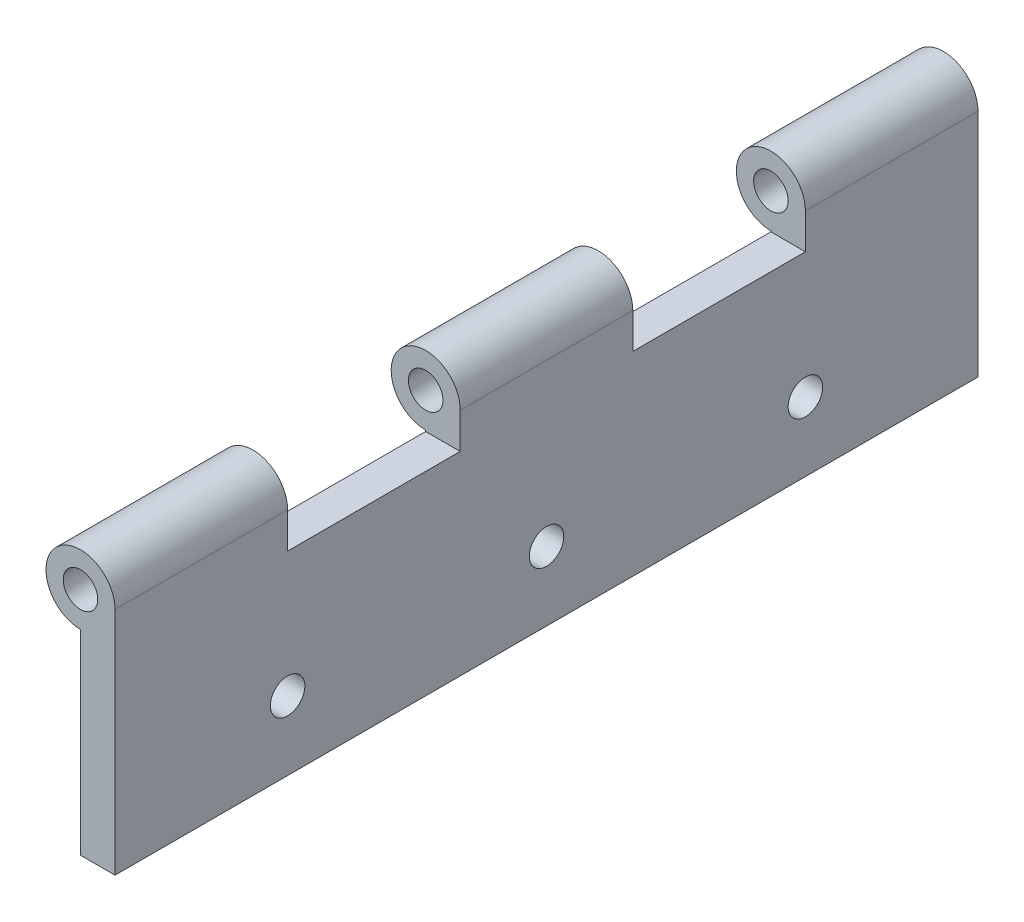
ISO-10303-21;
HEADER;
FILE_DESCRIPTION(('STEP AP214'),'2;1');
FILE_NAME('part.step','',(''),(''),'','','');
FILE_SCHEMA(('AUTOMOTIVE_DESIGN { 1 0 10303 214 1 1 1 1 }'));
ENDSEC;
DATA;
#1=APPLICATION_CONTEXT('core data for automotive mechanical design processes');
#2=APPLICATION_PROTOCOL_DEFINITION('international standard','automotive_design',2000,#1);
#3=PRODUCT_CONTEXT('',#1,'mechanical');
#4=PRODUCT('Part','Part','',(#3));
#5=PRODUCT_RELATED_PRODUCT_CATEGORY('part','',(#4));
#6=PRODUCT_DEFINITION_FORMATION('','',#4);
#7=PRODUCT_DEFINITION_CONTEXT('part definition',#1,'design');
#8=PRODUCT_DEFINITION('design','',#6,#7);
#9=PRODUCT_DEFINITION_SHAPE('','',#8);
#10=(LENGTH_UNIT() NAMED_UNIT(*) SI_UNIT(.MILLI.,.METRE.));
#11=(NAMED_UNIT(*) PLANE_ANGLE_UNIT() SI_UNIT($,.RADIAN.));
#12=(NAMED_UNIT(*) SI_UNIT($,.STERADIAN.) SOLID_ANGLE_UNIT());
#13=UNCERTAINTY_MEASURE_WITH_UNIT(LENGTH_MEASURE(1.E-05),#10,'distance_accuracy_value','');
#14=(GEOMETRIC_REPRESENTATION_CONTEXT(3) GLOBAL_UNCERTAINTY_ASSIGNED_CONTEXT((#13)) GLOBAL_UNIT_ASSIGNED_CONTEXT((#10,
#11,#12)) REPRESENTATION_CONTEXT('',''));
#15=CARTESIAN_POINT('',(0.,0.,0.));
#16=DIRECTION('',(0.,0.,1.));
#17=DIRECTION('',(1.,0.,0.));
#18=AXIS2_PLACEMENT_3D('',#15,#16,#17);
#19=CARTESIAN_POINT('',(-2.04654469579591,6.35636869469393,-37.5));
#20=DIRECTION('',(0.,0.,1.));
#21=DIRECTION('',(1.,0.,0.));
#22=AXIS2_PLACEMENT_3D('',#19,#20,#21);
#23=CYLINDRICAL_SURFACE('',#22,3.);
#24=DIRECTION('',(0.,0.,1.));
#25=VECTOR('',#24,1.);
#26=CARTESIAN_POINT('',(0.95345530420409,6.35636869469393,-37.5));
#27=LINE('',#26,#25);
#28=CARTESIAN_POINT('',(0.95345530420409,6.35636869469393,22.5));
#29=VERTEX_POINT('',#28);
#30=CARTESIAN_POINT('',(0.95345530420409,6.35636869469393,37.5));
#31=VERTEX_POINT('',#30);
#32=EDGE_CURVE('E237',#29,#31,#27,.T.);
#33=ORIENTED_EDGE('',*,*,#32,.F.);
#34=CARTESIAN_POINT('',(-2.04654469579591,6.35636869469393,22.5));
#35=DIRECTION('',(0.,0.,-1.));
#36=DIRECTION('',(0.,1.,0.));
#37=AXIS2_PLACEMENT_3D('',#34,#35,#36);
#38=CIRCLE('',#37,3.);
#39=CARTESIAN_POINT('',(-2.04654469579591,3.35636869469393,22.5));
#40=VERTEX_POINT('',#39);
#41=EDGE_CURVE('E187',#29,#40,#38,.F.);
#42=ORIENTED_EDGE('',*,*,#41,.T.);
#43=DIRECTION('',(0.,0.,1.));
#44=VECTOR('',#43,1.);
#45=CARTESIAN_POINT('',(-2.04654469579591,3.35636869469393,-37.5));
#46=LINE('',#45,#44);
#47=CARTESIAN_POINT('',(-2.04654469579591,3.35636869469393,37.5));
#48=VERTEX_POINT('',#47);
#49=EDGE_CURVE('E234',#40,#48,#46,.T.);
#50=ORIENTED_EDGE('',*,*,#49,.T.);
#51=CARTESIAN_POINT('',(-2.04654469579591,6.35636869469393,37.5));
#52=DIRECTION('',(0.,0.,1.));
#53=DIRECTION('',(1.,0.,0.));
#54=AXIS2_PLACEMENT_3D('',#51,#52,#53);
#55=CIRCLE('',#54,3.);
#56=EDGE_CURVE('E208',#31,#48,#55,.T.);
#57=ORIENTED_EDGE('',*,*,#56,.F.);
#58=EDGE_LOOP('',(#33,#42,#50,#57));
#59=FACE_BOUND('',#58,.T.);
#60=ADVANCED_FACE('F45',(#59),#23,.T.);
#61=CARTESIAN_POINT('',(-2.04654469579591,3.35636869469393,-7.5));
#62=VERTEX_POINT('',#61);
#63=CARTESIAN_POINT('',(-2.04654469579591,3.35636869469393,7.5));
#64=VERTEX_POINT('',#63);
#65=EDGE_CURVE('E245',#62,#64,#46,.T.);
#66=ORIENTED_EDGE('',*,*,#65,.T.);
#67=CARTESIAN_POINT('',(-2.04654469579591,6.35636869469393,7.5));
#68=DIRECTION('',(0.,0.,1.));
#69=DIRECTION('',(0.,-1.,0.));
#70=AXIS2_PLACEMENT_3D('',#67,#68,#69);
#71=CIRCLE('',#70,3.);
#72=CARTESIAN_POINT('',(0.95345530420409,6.35636869469393,7.5));
#73=VERTEX_POINT('',#72);
#74=EDGE_CURVE('E177',#64,#73,#71,.F.);
#75=ORIENTED_EDGE('',*,*,#74,.T.);
#76=CARTESIAN_POINT('',(0.95345530420409,6.35636869469393,-7.5));
#77=VERTEX_POINT('',#76);
#78=EDGE_CURVE('E236',#77,#73,#27,.T.);
#79=ORIENTED_EDGE('',*,*,#78,.F.);
#80=CARTESIAN_POINT('',(-2.04654469579591,6.35636869469393,-7.5));
#81=DIRECTION('',(0.,0.,-1.));
#82=DIRECTION('',(0.,1.,0.));
#83=AXIS2_PLACEMENT_3D('',#80,#81,#82);
#84=CIRCLE('',#83,3.);
#85=EDGE_CURVE('E168',#77,#62,#84,.F.);
#86=ORIENTED_EDGE('',*,*,#85,.T.);
#87=EDGE_LOOP('',(#66,#75,#79,#86));
#88=FACE_BOUND('',#87,.T.);
#89=ADVANCED_FACE('F277',(#88),#23,.T.);
#90=CARTESIAN_POINT('',(-2.04654469579591,3.35636869469393,-37.5));
#91=VERTEX_POINT('',#90);
#92=CARTESIAN_POINT('',(-2.04654469579591,3.35636869469393,-22.5));
#93=VERTEX_POINT('',#92);
#94=EDGE_CURVE('E242',#91,#93,#46,.T.);
#95=ORIENTED_EDGE('',*,*,#94,.T.);
#96=CARTESIAN_POINT('',(-2.04654469579591,6.35636869469393,-22.5));
#97=DIRECTION('',(0.,0.,1.));
#98=DIRECTION('',(1.,0.,0.));
#99=AXIS2_PLACEMENT_3D('',#96,#97,#98);
#100=CIRCLE('',#99,3.);
#101=CARTESIAN_POINT('',(0.95345530420409,6.35636869469393,-22.5));
#102=VERTEX_POINT('',#101);
#103=EDGE_CURVE('E158',#93,#102,#100,.F.);
#104=ORIENTED_EDGE('',*,*,#103,.T.);
#105=CARTESIAN_POINT('',(0.95345530420409,6.35636869469393,-37.5));
#106=VERTEX_POINT('',#105);
#107=EDGE_CURVE('E156',#106,#102,#27,.T.);
#108=ORIENTED_EDGE('',*,*,#107,.F.);
#109=CARTESIAN_POINT('',(-2.04654469579591,6.35636869469393,-37.5));
#110=DIRECTION('',(0.,0.,1.));
#111=DIRECTION('',(1.,0.,0.));
#112=AXIS2_PLACEMENT_3D('',#109,#110,#111);
#113=CIRCLE('',#112,3.);
#114=EDGE_CURVE('E223',#106,#91,#113,.T.);
#115=ORIENTED_EDGE('',*,*,#114,.T.);
#116=EDGE_LOOP('',(#95,#104,#108,#115));
#117=FACE_BOUND('',#116,.T.);
#118=ADVANCED_FACE('F279',(#117),#23,.T.);
#119=CARTESIAN_POINT('',(0.95345530420409,-13.6436313053061,-37.5));
#120=DIRECTION('',(1.,0.,0.));
#121=DIRECTION('',(0.,0.,-1.));
#122=AXIS2_PLACEMENT_3D('',#119,#120,#121);
#123=PLANE('',#122);
#124=CARTESIAN_POINT('',(0.95345530420409,-7.64363130530606,0.));
#125=DIRECTION('',(1.,0.,0.));
#126=DIRECTION('',(0.,0.,-1.));
#127=AXIS2_PLACEMENT_3D('',#124,#125,#126);
#128=CIRCLE('',#127,1.5);
#129=CARTESIAN_POINT('',(0.95345530420409,-7.64363130530606,-1.5));
#130=VERTEX_POINT('',#129);
#131=EDGE_CURVE('E196',#130,#130,#128,.F.);
#132=ORIENTED_EDGE('',*,*,#131,.T.);
#133=EDGE_LOOP('',(#132));
#134=FACE_BOUND('',#133,.T.);
#135=CARTESIAN_POINT('',(0.95345530420409,-7.64363130530607,22.5));
#136=DIRECTION('',(1.,0.,0.));
#137=DIRECTION('',(0.,0.,-1.));
#138=AXIS2_PLACEMENT_3D('',#135,#136,#137);
#139=CIRCLE('',#138,1.5);
#140=CARTESIAN_POINT('',(0.95345530420409,-7.64363130530607,21.));
#141=VERTEX_POINT('',#140);
#142=EDGE_CURVE('E192',#141,#141,#139,.F.);
#143=ORIENTED_EDGE('',*,*,#142,.T.);
#144=EDGE_LOOP('',(#143));
#145=FACE_BOUND('',#144,.T.);
#146=CARTESIAN_POINT('',(0.95345530420409,-7.64363130530606,-22.5));
#147=DIRECTION('',(1.,0.,0.));
#148=DIRECTION('',(0.,0.,-1.));
#149=AXIS2_PLACEMENT_3D('',#146,#147,#148);
#150=CIRCLE('',#149,1.5);
#151=CARTESIAN_POINT('',(0.95345530420409,-7.64363130530606,-24.));
#152=VERTEX_POINT('',#151);
#153=EDGE_CURVE('E200',#152,#152,#150,.F.);
#154=ORIENTED_EDGE('',*,*,#153,.T.);
#155=EDGE_LOOP('',(#154));
#156=FACE_BOUND('',#155,.T.);
#157=DIRECTION('',(0.,0.,1.));
#158=VECTOR('',#157,1.);
#159=CARTESIAN_POINT('',(0.95345530420409,3.251,-37.5));
#160=LINE('',#159,#158);
#161=CARTESIAN_POINT('',(0.95345530420409,3.251,7.5));
#162=VERTEX_POINT('',#161);
#163=CARTESIAN_POINT('',(0.95345530420409,3.251,22.5));
#164=VERTEX_POINT('',#163);
#165=EDGE_CURVE('E203',#162,#164,#160,.T.);
#166=ORIENTED_EDGE('',*,*,#165,.T.);
#167=DIRECTION('',(0.,1.,0.));
#168=VECTOR('',#167,1.);
#169=CARTESIAN_POINT('',(0.95345530420409,-13.643631305306,22.5));
#170=LINE('',#169,#168);
#171=EDGE_CURVE('E140',#164,#29,#170,.T.);
#172=ORIENTED_EDGE('',*,*,#171,.T.);
#173=ORIENTED_EDGE('',*,*,#32,.T.);
#174=DIRECTION('',(0.,1.,0.));
#175=VECTOR('',#174,1.);
#176=CARTESIAN_POINT('',(0.95345530420409,-13.6436313053061,37.5));
#177=LINE('',#176,#175);
#178=CARTESIAN_POINT('',(0.95345530420409,-13.6436313053061,37.5));
#179=VERTEX_POINT('',#178);
#180=EDGE_CURVE('E217',#179,#31,#177,.T.);
#181=ORIENTED_EDGE('',*,*,#180,.F.);
#182=DIRECTION('',(0.,0.,1.));
#183=VECTOR('',#182,1.);
#184=CARTESIAN_POINT('',(0.95345530420409,-13.6436313053061,-37.5));
#185=LINE('',#184,#183);
#186=CARTESIAN_POINT('',(0.95345530420409,-13.6436313053061,-37.5));
#187=VERTEX_POINT('',#186);
#188=EDGE_CURVE('E238',#187,#179,#185,.T.);
#189=ORIENTED_EDGE('',*,*,#188,.F.);
#190=DIRECTION('',(0.,1.,0.));
#191=VECTOR('',#190,1.);
#192=CARTESIAN_POINT('',(0.95345530420409,-13.6436313053061,-37.5));
#193=LINE('',#192,#191);
#194=EDGE_CURVE('E232',#187,#106,#193,.T.);
#195=ORIENTED_EDGE('',*,*,#194,.T.);
#196=ORIENTED_EDGE('',*,*,#107,.T.);
#197=DIRECTION('',(0.,-1.,0.));
#198=VECTOR('',#197,1.);
#199=CARTESIAN_POINT('',(0.95345530420409,-13.6436313053061,-22.5));
#200=LINE('',#199,#198);
#201=CARTESIAN_POINT('',(0.95345530420409,3.27739049523679,-22.5));
#202=VERTEX_POINT('',#201);
#203=EDGE_CURVE('E145',#102,#202,#200,.T.);
#204=ORIENTED_EDGE('',*,*,#203,.T.);
#205=DIRECTION('',(0.,0.,1.));
#206=VECTOR('',#205,1.);
#207=CARTESIAN_POINT('',(0.95345530420409,3.27739049523679,-37.5));
#208=LINE('',#207,#206);
#209=CARTESIAN_POINT('',(0.95345530420409,3.27739049523679,-7.5));
#210=VERTEX_POINT('',#209);
#211=EDGE_CURVE('E132',#202,#210,#208,.T.);
#212=ORIENTED_EDGE('',*,*,#211,.T.);
#213=DIRECTION('',(0.,1.,0.));
#214=VECTOR('',#213,1.);
#215=CARTESIAN_POINT('',(0.95345530420409,-13.6436313053061,-7.5));
#216=LINE('',#215,#214);
#217=EDGE_CURVE('E171',#210,#77,#216,.T.);
#218=ORIENTED_EDGE('',*,*,#217,.T.);
#219=ORIENTED_EDGE('',*,*,#78,.T.);
#220=DIRECTION('',(0.,-1.,0.));
#221=VECTOR('',#220,1.);
#222=CARTESIAN_POINT('',(0.95345530420409,-13.6436313053061,7.5));
#223=LINE('',#222,#221);
#224=EDGE_CURVE('E180',#73,#162,#223,.T.);
#225=ORIENTED_EDGE('',*,*,#224,.T.);
#226=EDGE_LOOP('',(#166,#172,#173,#181,#189,#195,#196,#204,#212,#218,#219,#225));
#227=FACE_BOUND('',#226,.T.);
#228=ADVANCED_FACE('F154',(#134,#145,#156,#227),#123,.T.);
#229=CARTESIAN_POINT('',(-2.04654469579591,-13.6436313053061,-37.5));
#230=DIRECTION('',(-1.,0.,0.));
#231=DIRECTION('',(0.,0.,1.));
#232=AXIS2_PLACEMENT_3D('',#229,#230,#231);
#233=PLANE('',#232);
#234=CARTESIAN_POINT('',(-2.04654469579591,-7.64363130530606,0.));
#235=DIRECTION('',(-1.,0.,0.));
#236=DIRECTION('',(0.,0.,1.));
#237=AXIS2_PLACEMENT_3D('',#234,#235,#236);
#238=CIRCLE('',#237,1.5);
#239=CARTESIAN_POINT('',(-2.04654469579591,-7.64363130530606,1.5));
#240=VERTEX_POINT('',#239);
#241=EDGE_CURVE('E195',#240,#240,#238,.F.);
#242=ORIENTED_EDGE('',*,*,#241,.T.);
#243=EDGE_LOOP('',(#242));
#244=FACE_BOUND('',#243,.T.);
#245=CARTESIAN_POINT('',(-2.04654469579591,-7.64363130530607,22.5));
#246=DIRECTION('',(-1.,0.,0.));
#247=DIRECTION('',(0.,0.,1.));
#248=AXIS2_PLACEMENT_3D('',#245,#246,#247);
#249=CIRCLE('',#248,1.5);
#250=CARTESIAN_POINT('',(-2.04654469579591,-7.64363130530607,24.));
#251=VERTEX_POINT('',#250);
#252=EDGE_CURVE('E139',#251,#251,#249,.F.);
#253=ORIENTED_EDGE('',*,*,#252,.T.);
#254=EDGE_LOOP('',(#253));
#255=FACE_BOUND('',#254,.T.);
#256=CARTESIAN_POINT('',(-2.04654469579591,-7.64363130530606,-22.5));
#257=DIRECTION('',(-1.,0.,0.));
#258=DIRECTION('',(0.,0.,1.));
#259=AXIS2_PLACEMENT_3D('',#256,#257,#258);
#260=CIRCLE('',#259,1.5);
#261=CARTESIAN_POINT('',(-2.04654469579591,-7.64363130530606,-21.));
#262=VERTEX_POINT('',#261);
#263=EDGE_CURVE('E199',#262,#262,#260,.F.);
#264=ORIENTED_EDGE('',*,*,#263,.T.);
#265=EDGE_LOOP('',(#264));
#266=FACE_BOUND('',#265,.T.);
#267=ORIENTED_EDGE('',*,*,#49,.F.);
#268=DIRECTION('',(0.,-1.,0.));
#269=VECTOR('',#268,1.);
#270=CARTESIAN_POINT('',(-2.04654469579591,-13.643631305306,22.5));
#271=LINE('',#270,#269);
#272=CARTESIAN_POINT('',(-2.04654469579591,3.251,22.5));
#273=VERTEX_POINT('',#272);
#274=EDGE_CURVE('E184',#40,#273,#271,.T.);
#275=ORIENTED_EDGE('',*,*,#274,.T.);
#276=DIRECTION('',(0.,0.,-1.));
#277=VECTOR('',#276,1.);
#278=CARTESIAN_POINT('',(-2.04654469579591,3.251,-37.5));
#279=LINE('',#278,#277);
#280=CARTESIAN_POINT('',(-2.04654469579591,3.251,7.5));
#281=VERTEX_POINT('',#280);
#282=EDGE_CURVE('E13',#273,#281,#279,.T.);
#283=ORIENTED_EDGE('',*,*,#282,.T.);
#284=DIRECTION('',(0.,1.,0.));
#285=VECTOR('',#284,1.);
#286=CARTESIAN_POINT('',(-2.04654469579591,-13.6436313053061,7.5));
#287=LINE('',#286,#285);
#288=EDGE_CURVE('E174',#281,#64,#287,.T.);
#289=ORIENTED_EDGE('',*,*,#288,.T.);
#290=ORIENTED_EDGE('',*,*,#65,.F.);
#291=DIRECTION('',(0.,-1.,0.));
#292=VECTOR('',#291,1.);
#293=CARTESIAN_POINT('',(-2.04654469579591,-13.6436313053061,-7.5));
#294=LINE('',#293,#292);
#295=CARTESIAN_POINT('',(-2.04654469579591,3.27739049523679,-7.5));
#296=VERTEX_POINT('',#295);
#297=EDGE_CURVE('E161',#62,#296,#294,.T.);
#298=ORIENTED_EDGE('',*,*,#297,.T.);
#299=DIRECTION('',(0.,0.,-1.));
#300=VECTOR('',#299,1.);
#301=CARTESIAN_POINT('',(-2.04654469579591,3.27739049523679,-37.5));
#302=LINE('',#301,#300);
#303=CARTESIAN_POINT('',(-2.04654469579591,3.27739049523679,-22.5));
#304=VERTEX_POINT('',#303);
#305=EDGE_CURVE('E52',#296,#304,#302,.T.);
#306=ORIENTED_EDGE('',*,*,#305,.T.);
#307=DIRECTION('',(0.,1.,0.));
#308=VECTOR('',#307,1.);
#309=CARTESIAN_POINT('',(-2.04654469579591,-13.6436313053061,-22.5));
#310=LINE('',#309,#308);
#311=EDGE_CURVE('E148',#304,#93,#310,.T.);
#312=ORIENTED_EDGE('',*,*,#311,.T.);
#313=ORIENTED_EDGE('',*,*,#94,.F.);
#314=DIRECTION('',(0.,-1.,0.));
#315=VECTOR('',#314,1.);
#316=CARTESIAN_POINT('',(-2.04654469579591,-13.6436313053061,-37.5));
#317=LINE('',#316,#315);
#318=CARTESIAN_POINT('',(-2.04654469579591,-13.6436313053061,-37.5));
#319=VERTEX_POINT('',#318);
#320=EDGE_CURVE('E226',#91,#319,#317,.T.);
#321=ORIENTED_EDGE('',*,*,#320,.T.);
#322=DIRECTION('',(0.,0.,1.));
#323=VECTOR('',#322,1.);
#324=CARTESIAN_POINT('',(-2.04654469579591,-13.6436313053061,-37.5));
#325=LINE('',#324,#323);
#326=CARTESIAN_POINT('',(-2.04654469579591,-13.6436313053061,37.5));
#327=VERTEX_POINT('',#326);
#328=EDGE_CURVE('E240',#319,#327,#325,.T.);
#329=ORIENTED_EDGE('',*,*,#328,.T.);
#330=DIRECTION('',(0.,-1.,0.));
#331=VECTOR('',#330,1.);
#332=CARTESIAN_POINT('',(-2.04654469579591,-13.6436313053061,37.5));
#333=LINE('',#332,#331);
#334=EDGE_CURVE('E211',#48,#327,#333,.T.);
#335=ORIENTED_EDGE('',*,*,#334,.F.);
#336=EDGE_LOOP('',(#267,#275,#283,#289,#290,#298,#306,#312,#313,#321,#329,#335));
#337=FACE_BOUND('',#336,.T.);
#338=ADVANCED_FACE('F259',(#244,#255,#266,#337),#233,.T.);
#339=CARTESIAN_POINT('',(-2.04654469579591,6.35636869469393,-37.5));
#340=DIRECTION('',(0.,0.,1.));
#341=DIRECTION('',(1.,0.,0.));
#342=AXIS2_PLACEMENT_3D('',#339,#340,#341);
#343=CYLINDRICAL_SURFACE('',#342,1.5);
#344=CARTESIAN_POINT('',(-2.04654469579591,6.35636869469393,37.5));
#345=DIRECTION('',(0.,0.,1.));
#346=DIRECTION('',(1.,0.,0.));
#347=AXIS2_PLACEMENT_3D('',#344,#345,#346);
#348=CIRCLE('',#347,1.5);
#349=CARTESIAN_POINT('',(-0.54654469579591,6.35636869469393,37.5));
#350=VERTEX_POINT('',#349);
#351=EDGE_CURVE('E205',#350,#350,#348,.T.);
#352=ORIENTED_EDGE('',*,*,#351,.T.);
#353=EDGE_LOOP('',(#352));
#354=FACE_BOUND('',#353,.T.);
#355=CARTESIAN_POINT('',(-2.04654469579591,6.35636869469393,22.5));
#356=DIRECTION('',(0.,0.,-1.));
#357=DIRECTION('',(0.,1.,0.));
#358=AXIS2_PLACEMENT_3D('',#355,#356,#357);
#359=CIRCLE('',#358,1.5);
#360=CARTESIAN_POINT('',(-2.04654469579591,7.85636869469394,22.5));
#361=VERTEX_POINT('',#360);
#362=EDGE_CURVE('E183',#361,#361,#359,.F.);
#363=ORIENTED_EDGE('',*,*,#362,.F.);
#364=EDGE_LOOP('',(#363));
#365=FACE_BOUND('',#364,.T.);
#366=ADVANCED_FACE('F342',(#354,#365),#343,.F.);
#367=CARTESIAN_POINT('',(-2.04654469579591,6.35636869469393,-37.5));
#368=DIRECTION('',(0.,0.,1.));
#369=DIRECTION('',(1.,0.,0.));
#370=AXIS2_PLACEMENT_3D('',#367,#368,#369);
#371=CIRCLE('',#370,1.5);
#372=CARTESIAN_POINT('',(-0.54654469579591,6.35636869469393,-37.5));
#373=VERTEX_POINT('',#372);
#374=EDGE_CURVE('E220',#373,#373,#371,.T.);
#375=ORIENTED_EDGE('',*,*,#374,.F.);
#376=EDGE_LOOP('',(#375));
#377=FACE_BOUND('',#376,.T.);
#378=CARTESIAN_POINT('',(-2.04654469579591,6.35636869469393,-22.5));
#379=DIRECTION('',(0.,0.,1.));
#380=DIRECTION('',(1.,0.,0.));
#381=AXIS2_PLACEMENT_3D('',#378,#379,#380);
#382=CIRCLE('',#381,1.5);
#383=CARTESIAN_POINT('',(-0.54654469579591,6.35636869469393,-22.5));
#384=VERTEX_POINT('',#383);
#385=EDGE_CURVE('E150',#384,#384,#382,.F.);
#386=ORIENTED_EDGE('',*,*,#385,.F.);
#387=EDGE_LOOP('',(#386));
#388=FACE_BOUND('',#387,.T.);
#389=ADVANCED_FACE('F341',(#377,#388),#343,.F.);
#390=CARTESIAN_POINT('',(-2.04654469579591,-13.6436313053061,-37.5));
#391=DIRECTION('',(0.,-1.,0.));
#392=DIRECTION('',(0.,0.,-1.));
#393=AXIS2_PLACEMENT_3D('',#390,#391,#392);
#394=PLANE('',#393);
#395=ORIENTED_EDGE('',*,*,#188,.T.);
#396=DIRECTION('',(1.,0.,0.));
#397=VECTOR('',#396,1.);
#398=CARTESIAN_POINT('',(-2.04654469579591,-13.6436313053061,37.5));
#399=LINE('',#398,#397);
#400=EDGE_CURVE('E214',#327,#179,#399,.T.);
#401=ORIENTED_EDGE('',*,*,#400,.F.);
#402=ORIENTED_EDGE('',*,*,#328,.F.);
#403=DIRECTION('',(1.,0.,0.));
#404=VECTOR('',#403,1.);
#405=CARTESIAN_POINT('',(-2.04654469579591,-13.6436313053061,-37.5));
#406=LINE('',#405,#404);
#407=EDGE_CURVE('E229',#319,#187,#406,.T.);
#408=ORIENTED_EDGE('',*,*,#407,.T.);
#409=EDGE_LOOP('',(#395,#401,#402,#408));
#410=FACE_BOUND('',#409,.T.);
#411=ADVANCED_FACE('F300',(#410),#394,.T.);
#412=CARTESIAN_POINT('',(-2.04654469579591,6.35636869469393,-37.5));
#413=DIRECTION('',(0.,0.,1.));
#414=DIRECTION('',(1.,0.,0.));
#415=AXIS2_PLACEMENT_3D('',#412,#413,#414);
#416=PLANE('',#415);
#417=ORIENTED_EDGE('',*,*,#374,.T.);
#418=EDGE_LOOP('',(#417));
#419=FACE_BOUND('',#418,.T.);
#420=ORIENTED_EDGE('',*,*,#114,.F.);
#421=ORIENTED_EDGE('',*,*,#194,.F.);
#422=ORIENTED_EDGE('',*,*,#407,.F.);
#423=ORIENTED_EDGE('',*,*,#320,.F.);
#424=EDGE_LOOP('',(#420,#421,#422,#423));
#425=FACE_BOUND('',#424,.T.);
#426=ADVANCED_FACE('F297',(#419,#425),#416,.F.);
#427=CARTESIAN_POINT('',(-2.04654469579591,6.35636869469393,37.5));
#428=DIRECTION('',(0.,0.,1.));
#429=DIRECTION('',(1.,0.,0.));
#430=AXIS2_PLACEMENT_3D('',#427,#428,#429);
#431=PLANE('',#430);
#432=ORIENTED_EDGE('',*,*,#56,.T.);
#433=ORIENTED_EDGE('',*,*,#334,.T.);
#434=ORIENTED_EDGE('',*,*,#400,.T.);
#435=ORIENTED_EDGE('',*,*,#180,.T.);
#436=EDGE_LOOP('',(#432,#433,#434,#435));
#437=FACE_BOUND('',#436,.T.);
#438=ORIENTED_EDGE('',*,*,#351,.F.);
#439=EDGE_LOOP('',(#438));
#440=FACE_BOUND('',#439,.T.);
#441=ADVANCED_FACE('F304',(#437,#440),#431,.T.);
#442=CARTESIAN_POINT('',(-12.0465446957959,13.2773904952368,-7.5));
#443=DIRECTION('',(0.,0.,-1.));
#444=DIRECTION('',(0.,1.,0.));
#445=AXIS2_PLACEMENT_3D('',#442,#443,#444);
#446=PLANE('',#445);
#447=DIRECTION('',(1.,0.,0.));
#448=VECTOR('',#447,1.);
#449=CARTESIAN_POINT('',(-12.0465446957959,3.27739049523679,-7.5));
#450=LINE('',#449,#448);
#451=EDGE_CURVE('E135',#296,#210,#450,.T.);
#452=ORIENTED_EDGE('',*,*,#451,.F.);
#453=ORIENTED_EDGE('',*,*,#297,.F.);
#454=ORIENTED_EDGE('',*,*,#85,.F.);
#455=ORIENTED_EDGE('',*,*,#217,.F.);
#456=EDGE_LOOP('',(#452,#453,#454,#455));
#457=FACE_BOUND('',#456,.T.);
#458=CARTESIAN_POINT('',(-2.04654469579591,6.35636869469393,-7.5));
#459=DIRECTION('',(0.,0.,-1.));
#460=DIRECTION('',(0.,1.,0.));
#461=AXIS2_PLACEMENT_3D('',#458,#459,#460);
#462=CIRCLE('',#461,1.5);
#463=CARTESIAN_POINT('',(-2.04654469579591,7.85636869469394,-7.5));
#464=VERTEX_POINT('',#463);
#465=EDGE_CURVE('E157',#464,#464,#462,.F.);
#466=ORIENTED_EDGE('',*,*,#465,.T.);
#467=EDGE_LOOP('',(#466));
#468=FACE_BOUND('',#467,.T.);
#469=ADVANCED_FACE('F362',(#457,#468),#446,.T.);
#470=CARTESIAN_POINT('',(-12.0465446957959,13.2773904952368,-22.5));
#471=DIRECTION('',(0.,0.,1.));
#472=DIRECTION('',(1.,0.,0.));
#473=AXIS2_PLACEMENT_3D('',#470,#471,#472);
#474=PLANE('',#473);
#475=ORIENTED_EDGE('',*,*,#103,.F.);
#476=ORIENTED_EDGE('',*,*,#311,.F.);
#477=DIRECTION('',(1.,0.,0.));
#478=VECTOR('',#477,1.);
#479=CARTESIAN_POINT('',(-12.0465446957959,3.27739049523679,-22.5));
#480=LINE('',#479,#478);
#481=EDGE_CURVE('E67',#304,#202,#480,.T.);
#482=ORIENTED_EDGE('',*,*,#481,.T.);
#483=ORIENTED_EDGE('',*,*,#203,.F.);
#484=EDGE_LOOP('',(#475,#476,#482,#483));
#485=FACE_BOUND('',#484,.T.);
#486=ORIENTED_EDGE('',*,*,#385,.T.);
#487=EDGE_LOOP('',(#486));
#488=FACE_BOUND('',#487,.T.);
#489=ADVANCED_FACE('F143',(#485,#488),#474,.T.);
#490=CARTESIAN_POINT('',(-12.0465446957959,3.27739049523679,-22.5));
#491=DIRECTION('',(0.,1.,0.));
#492=DIRECTION('',(0.,0.,1.));
#493=AXIS2_PLACEMENT_3D('',#490,#491,#492);
#494=PLANE('',#493);
#495=ORIENTED_EDGE('',*,*,#481,.F.);
#496=ORIENTED_EDGE('',*,*,#305,.F.);
#497=ORIENTED_EDGE('',*,*,#451,.T.);
#498=ORIENTED_EDGE('',*,*,#211,.F.);
#499=EDGE_LOOP('',(#495,#496,#497,#498));
#500=FACE_BOUND('',#499,.T.);
#501=ADVANCED_FACE('F133',(#500),#494,.T.);
#502=ORIENTED_EDGE('',*,*,#465,.F.);
#503=EDGE_LOOP('',(#502));
#504=FACE_BOUND('',#503,.T.);
#505=CARTESIAN_POINT('',(-2.04654469579591,6.35636869469393,7.5));
#506=DIRECTION('',(0.,0.,1.));
#507=DIRECTION('',(0.,-1.,0.));
#508=AXIS2_PLACEMENT_3D('',#505,#506,#507);
#509=CIRCLE('',#508,1.5);
#510=CARTESIAN_POINT('',(-2.04654469579591,4.85636869469393,7.5));
#511=VERTEX_POINT('',#510);
#512=EDGE_CURVE('E173',#511,#511,#509,.F.);
#513=ORIENTED_EDGE('',*,*,#512,.F.);
#514=EDGE_LOOP('',(#513));
#515=FACE_BOUND('',#514,.T.);
#516=ADVANCED_FACE('F335',(#504,#515),#343,.F.);
#517=CARTESIAN_POINT('',(-12.0465446957959,13.251,22.5));
#518=DIRECTION('',(0.,0.,-1.));
#519=DIRECTION('',(0.,1.,0.));
#520=AXIS2_PLACEMENT_3D('',#517,#518,#519);
#521=PLANE('',#520);
#522=DIRECTION('',(1.,0.,0.));
#523=VECTOR('',#522,1.);
#524=CARTESIAN_POINT('',(-12.0465446957959,3.251,22.5));
#525=LINE('',#524,#523);
#526=EDGE_CURVE('E320',#273,#164,#525,.T.);
#527=ORIENTED_EDGE('',*,*,#526,.F.);
#528=ORIENTED_EDGE('',*,*,#274,.F.);
#529=ORIENTED_EDGE('',*,*,#41,.F.);
#530=ORIENTED_EDGE('',*,*,#171,.F.);
#531=EDGE_LOOP('',(#527,#528,#529,#530));
#532=FACE_BOUND('',#531,.T.);
#533=ORIENTED_EDGE('',*,*,#362,.T.);
#534=EDGE_LOOP('',(#533));
#535=FACE_BOUND('',#534,.T.);
#536=ADVANCED_FACE('F318',(#532,#535),#521,.T.);
#537=CARTESIAN_POINT('',(-12.0465446957959,13.251,7.5));
#538=DIRECTION('',(0.,0.,1.));
#539=DIRECTION('',(0.,-1.,0.));
#540=AXIS2_PLACEMENT_3D('',#537,#538,#539);
#541=PLANE('',#540);
#542=ORIENTED_EDGE('',*,*,#74,.F.);
#543=ORIENTED_EDGE('',*,*,#288,.F.);
#544=DIRECTION('',(1.,0.,0.));
#545=VECTOR('',#544,1.);
#546=CARTESIAN_POINT('',(-12.0465446957959,3.251,7.5));
#547=LINE('',#546,#545);
#548=EDGE_CURVE('E59',#281,#162,#547,.T.);
#549=ORIENTED_EDGE('',*,*,#548,.T.);
#550=ORIENTED_EDGE('',*,*,#224,.F.);
#551=EDGE_LOOP('',(#542,#543,#549,#550));
#552=FACE_BOUND('',#551,.T.);
#553=ORIENTED_EDGE('',*,*,#512,.T.);
#554=EDGE_LOOP('',(#553));
#555=FACE_BOUND('',#554,.T.);
#556=ADVANCED_FACE('F313',(#552,#555),#541,.T.);
#557=CARTESIAN_POINT('',(-12.0465446957959,3.251,7.5));
#558=DIRECTION('',(0.,1.,0.));
#559=DIRECTION('',(0.,0.,1.));
#560=AXIS2_PLACEMENT_3D('',#557,#558,#559);
#561=PLANE('',#560);
#562=ORIENTED_EDGE('',*,*,#548,.F.);
#563=ORIENTED_EDGE('',*,*,#282,.F.);
#564=ORIENTED_EDGE('',*,*,#526,.T.);
#565=ORIENTED_EDGE('',*,*,#165,.F.);
#566=EDGE_LOOP('',(#562,#563,#564,#565));
#567=FACE_BOUND('',#566,.T.);
#568=ADVANCED_FACE('F321',(#567),#561,.T.);
#569=CARTESIAN_POINT('',(-12.0465446957959,-7.64363130530607,22.5));
#570=DIRECTION('',(1.,0.,0.));
#571=DIRECTION('',(0.,0.,-1.));
#572=AXIS2_PLACEMENT_3D('',#569,#570,#571);
#573=CYLINDRICAL_SURFACE('',#572,1.5);
#574=ORIENTED_EDGE('',*,*,#142,.F.);
#575=EDGE_LOOP('',(#574));
#576=FACE_BOUND('',#575,.T.);
#577=ORIENTED_EDGE('',*,*,#252,.F.);
#578=EDGE_LOOP('',(#577));
#579=FACE_BOUND('',#578,.T.);
#580=ADVANCED_FACE('F270',(#576,#579),#573,.F.);
#581=CARTESIAN_POINT('',(-12.0465446957959,-7.64363130530606,0.));
#582=DIRECTION('',(1.,0.,0.));
#583=DIRECTION('',(0.,0.,-1.));
#584=AXIS2_PLACEMENT_3D('',#581,#582,#583);
#585=CYLINDRICAL_SURFACE('',#584,1.5);
#586=ORIENTED_EDGE('',*,*,#131,.F.);
#587=EDGE_LOOP('',(#586));
#588=FACE_BOUND('',#587,.T.);
#589=ORIENTED_EDGE('',*,*,#241,.F.);
#590=EDGE_LOOP('',(#589));
#591=FACE_BOUND('',#590,.T.);
#592=ADVANCED_FACE('F264',(#588,#591),#585,.F.);
#593=CARTESIAN_POINT('',(-12.0465446957959,-7.64363130530606,-22.5));
#594=DIRECTION('',(1.,0.,0.));
#595=DIRECTION('',(0.,0.,-1.));
#596=AXIS2_PLACEMENT_3D('',#593,#594,#595);
#597=CYLINDRICAL_SURFACE('',#596,1.5);
#598=ORIENTED_EDGE('',*,*,#153,.F.);
#599=EDGE_LOOP('',(#598));
#600=FACE_BOUND('',#599,.T.);
#601=ORIENTED_EDGE('',*,*,#263,.F.);
#602=EDGE_LOOP('',(#601));
#603=FACE_BOUND('',#602,.T.);
#604=ADVANCED_FACE('F262',(#600,#603),#597,.F.);
#605=CLOSED_SHELL('',(#60,#89,#118,#228,#338,#366,#389,#411,#426,#441,#469,#489,#501,#516,#536,
#556,#568,#580,#592,#604));
#606=MANIFOLD_SOLID_BREP('B2',#605);
#607=ADVANCED_BREP_SHAPE_REPRESENTATION('',(#18,#606),#14);
#608=SHAPE_DEFINITION_REPRESENTATION(#9,#607);
ENDSEC;
END-ISO-10303-21;
